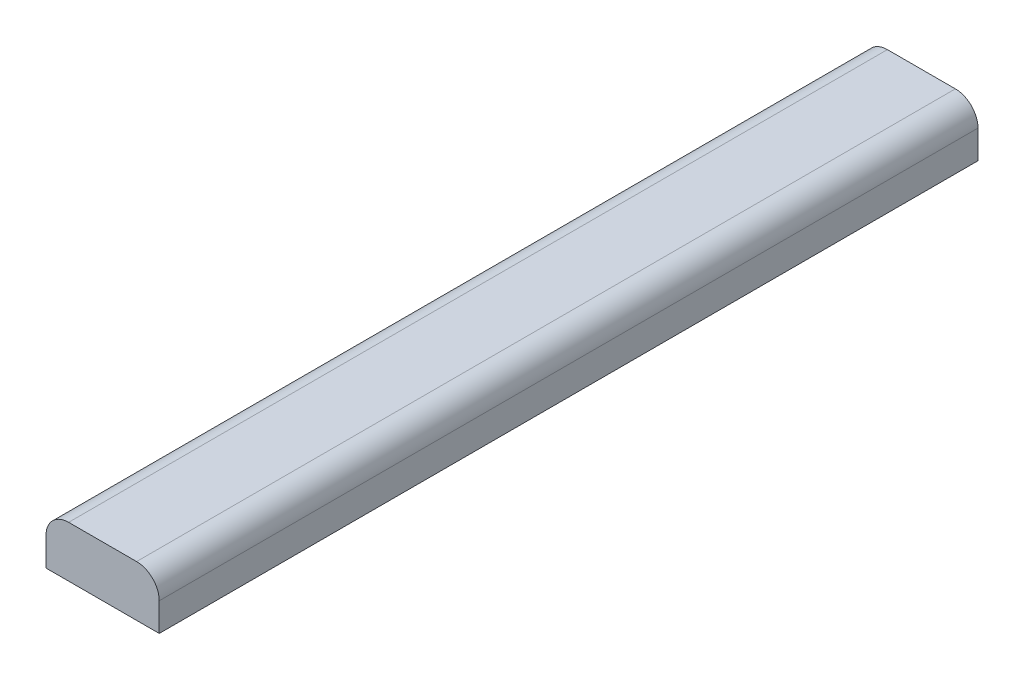
ISO-10303-21;
HEADER;
FILE_DESCRIPTION(('STEP AP214'),'2;1');
FILE_NAME('part.step','',(''),(''),'','','');
FILE_SCHEMA(('AUTOMOTIVE_DESIGN { 1 0 10303 214 1 1 1 1 }'));
ENDSEC;
DATA;
#1=APPLICATION_CONTEXT('core data for automotive mechanical design processes');
#2=APPLICATION_PROTOCOL_DEFINITION('international standard','automotive_design',2000,#1);
#3=PRODUCT_CONTEXT('',#1,'mechanical');
#4=PRODUCT('Part','Part','',(#3));
#5=PRODUCT_RELATED_PRODUCT_CATEGORY('part','',(#4));
#6=PRODUCT_DEFINITION_FORMATION('','',#4);
#7=PRODUCT_DEFINITION_CONTEXT('part definition',#1,'design');
#8=PRODUCT_DEFINITION('design','',#6,#7);
#9=PRODUCT_DEFINITION_SHAPE('','',#8);
#10=(LENGTH_UNIT() NAMED_UNIT(*) SI_UNIT(.MILLI.,.METRE.));
#11=(NAMED_UNIT(*) PLANE_ANGLE_UNIT() SI_UNIT($,.RADIAN.));
#12=(NAMED_UNIT(*) SI_UNIT($,.STERADIAN.) SOLID_ANGLE_UNIT());
#13=UNCERTAINTY_MEASURE_WITH_UNIT(LENGTH_MEASURE(1.E-05),#10,'distance_accuracy_value','');
#14=(GEOMETRIC_REPRESENTATION_CONTEXT(3) GLOBAL_UNCERTAINTY_ASSIGNED_CONTEXT((#13)) GLOBAL_UNIT_ASSIGNED_CONTEXT((#10,
#11,#12)) REPRESENTATION_CONTEXT('',''));
#15=CARTESIAN_POINT('',(0.,0.,0.));
#16=DIRECTION('',(0.,0.,1.));
#17=DIRECTION('',(1.,0.,0.));
#18=AXIS2_PLACEMENT_3D('',#15,#16,#17);
#19=CARTESIAN_POINT('',(0.,0.,918.21));
#20=DIRECTION('',(1.,0.,0.));
#21=DIRECTION('',(0.,0.,-1.));
#22=AXIS2_PLACEMENT_3D('',#19,#20,#21);
#23=PLANE('',#22);
#24=DIRECTION('',(0.,-1.,0.));
#25=VECTOR('',#24,1.);
#26=CARTESIAN_POINT('',(0.,0.,0.));
#27=LINE('',#26,#25);
#28=CARTESIAN_POINT('',(0.,31.7499999999998,0.));
#29=VERTEX_POINT('',#28);
#30=CARTESIAN_POINT('',(0.,0.,0.));
#31=VERTEX_POINT('',#30);
#32=EDGE_CURVE('E131',#29,#31,#27,.T.);
#33=ORIENTED_EDGE('',*,*,#32,.T.);
#34=DIRECTION('',(0.,0.,-1.));
#35=VECTOR('',#34,1.);
#36=CARTESIAN_POINT('',(0.,0.,918.21));
#37=LINE('',#36,#35);
#38=CARTESIAN_POINT('',(0.,0.,918.21));
#39=VERTEX_POINT('',#38);
#40=EDGE_CURVE('E11',#39,#31,#37,.T.);
#41=ORIENTED_EDGE('',*,*,#40,.F.);
#42=DIRECTION('',(0.,-1.,0.));
#43=VECTOR('',#42,1.);
#44=CARTESIAN_POINT('',(0.,0.,918.21));
#45=LINE('',#44,#43);
#46=CARTESIAN_POINT('',(0.,31.7499999999998,918.21));
#47=VERTEX_POINT('',#46);
#48=EDGE_CURVE('E141',#47,#39,#45,.T.);
#49=ORIENTED_EDGE('',*,*,#48,.F.);
#50=DIRECTION('',(0.,0.,-1.));
#51=VECTOR('',#50,1.);
#52=CARTESIAN_POINT('',(0.,31.7499999999998,918.21));
#53=LINE('',#52,#51);
#54=EDGE_CURVE('E127',#47,#29,#53,.T.);
#55=ORIENTED_EDGE('',*,*,#54,.T.);
#56=EDGE_LOOP('',(#33,#41,#49,#55));
#57=FACE_BOUND('',#56,.T.);
#58=ADVANCED_FACE('F47',(#57),#23,.F.);
#59=CARTESIAN_POINT('',(0.,0.,918.21));
#60=DIRECTION('',(0.,1.,0.));
#61=DIRECTION('',(0.,0.,1.));
#62=AXIS2_PLACEMENT_3D('',#59,#60,#61);
#63=PLANE('',#62);
#64=DIRECTION('',(1.,0.,0.));
#65=VECTOR('',#64,1.);
#66=CARTESIAN_POINT('',(0.,0.,0.));
#67=LINE('',#66,#65);
#68=CARTESIAN_POINT('',(127.,0.,0.));
#69=VERTEX_POINT('',#68);
#70=EDGE_CURVE('E134',#31,#69,#67,.T.);
#71=ORIENTED_EDGE('',*,*,#70,.T.);
#72=DIRECTION('',(0.,0.,-1.));
#73=VECTOR('',#72,1.);
#74=CARTESIAN_POINT('',(127.,0.,918.21));
#75=LINE('',#74,#73);
#76=CARTESIAN_POINT('',(127.,0.,918.21));
#77=VERTEX_POINT('',#76);
#78=EDGE_CURVE('E55',#77,#69,#75,.T.);
#79=ORIENTED_EDGE('',*,*,#78,.F.);
#80=DIRECTION('',(1.,0.,0.));
#81=VECTOR('',#80,1.);
#82=CARTESIAN_POINT('',(0.,0.,918.21));
#83=LINE('',#82,#81);
#84=EDGE_CURVE('E100',#39,#77,#83,.T.);
#85=ORIENTED_EDGE('',*,*,#84,.F.);
#86=ORIENTED_EDGE('',*,*,#40,.T.);
#87=EDGE_LOOP('',(#71,#79,#85,#86));
#88=FACE_BOUND('',#87,.T.);
#89=ADVANCED_FACE('F166',(#88),#63,.F.);
#90=CARTESIAN_POINT('',(127.,0.,918.21));
#91=DIRECTION('',(-1.,0.,0.));
#92=DIRECTION('',(0.,0.,1.));
#93=AXIS2_PLACEMENT_3D('',#90,#91,#92);
#94=PLANE('',#93);
#95=DIRECTION('',(0.,1.,0.));
#96=VECTOR('',#95,1.);
#97=CARTESIAN_POINT('',(127.,0.,0.));
#98=LINE('',#97,#96);
#99=CARTESIAN_POINT('',(127.,31.7499999999998,0.));
#100=VERTEX_POINT('',#99);
#101=EDGE_CURVE('E136',#69,#100,#98,.T.);
#102=ORIENTED_EDGE('',*,*,#101,.T.);
#103=DIRECTION('',(0.,0.,-1.));
#104=VECTOR('',#103,1.);
#105=CARTESIAN_POINT('',(127.,31.7499999999998,918.21));
#106=LINE('',#105,#104);
#107=CARTESIAN_POINT('',(127.,31.7499999999998,918.21));
#108=VERTEX_POINT('',#107);
#109=EDGE_CURVE('E122',#108,#100,#106,.T.);
#110=ORIENTED_EDGE('',*,*,#109,.F.);
#111=DIRECTION('',(0.,1.,0.));
#112=VECTOR('',#111,1.);
#113=CARTESIAN_POINT('',(127.,0.,918.21));
#114=LINE('',#113,#112);
#115=EDGE_CURVE('E113',#77,#108,#114,.T.);
#116=ORIENTED_EDGE('',*,*,#115,.F.);
#117=ORIENTED_EDGE('',*,*,#78,.T.);
#118=EDGE_LOOP('',(#102,#110,#116,#117));
#119=FACE_BOUND('',#118,.T.);
#120=ADVANCED_FACE('F147',(#119),#94,.F.);
#121=CARTESIAN_POINT('',(101.6,31.75,918.21));
#122=DIRECTION('',(0.,0.,-1.));
#123=DIRECTION('',(-1.,0.,0.));
#124=AXIS2_PLACEMENT_3D('',#121,#122,#123);
#125=CYLINDRICAL_SURFACE('',#124,25.4);
#126=CARTESIAN_POINT('',(101.6,31.75,0.));
#127=DIRECTION('',(0.,0.,1.));
#128=DIRECTION('',(-1.,0.,0.));
#129=AXIS2_PLACEMENT_3D('',#126,#127,#128);
#130=CIRCLE('',#129,25.4);
#131=CARTESIAN_POINT('',(101.6,57.15,0.));
#132=VERTEX_POINT('',#131);
#133=EDGE_CURVE('E121',#100,#132,#130,.T.);
#134=ORIENTED_EDGE('',*,*,#133,.T.);
#135=DIRECTION('',(0.,0.,-1.));
#136=VECTOR('',#135,1.);
#137=CARTESIAN_POINT('',(101.6,57.15,918.21));
#138=LINE('',#137,#136);
#139=CARTESIAN_POINT('',(101.6,57.15,918.21));
#140=VERTEX_POINT('',#139);
#141=EDGE_CURVE('E118',#140,#132,#138,.T.);
#142=ORIENTED_EDGE('',*,*,#141,.F.);
#143=CARTESIAN_POINT('',(101.6,31.75,918.21));
#144=DIRECTION('',(0.,0.,1.));
#145=DIRECTION('',(-1.,0.,0.));
#146=AXIS2_PLACEMENT_3D('',#143,#144,#145);
#147=CIRCLE('',#146,25.4);
#148=EDGE_CURVE('E107',#108,#140,#147,.T.);
#149=ORIENTED_EDGE('',*,*,#148,.F.);
#150=ORIENTED_EDGE('',*,*,#109,.T.);
#151=EDGE_LOOP('',(#134,#142,#149,#150));
#152=FACE_BOUND('',#151,.T.);
#153=ADVANCED_FACE('F119',(#152),#125,.T.);
#154=CARTESIAN_POINT('',(25.4000000000002,57.15,918.21));
#155=DIRECTION('',(0.,-1.,0.));
#156=DIRECTION('',(0.,0.,-1.));
#157=AXIS2_PLACEMENT_3D('',#154,#155,#156);
#158=PLANE('',#157);
#159=DIRECTION('',(-1.,0.,0.));
#160=VECTOR('',#159,1.);
#161=CARTESIAN_POINT('',(25.4000000000002,57.15,0.));
#162=LINE('',#161,#160);
#163=CARTESIAN_POINT('',(25.4000000000002,57.15,0.));
#164=VERTEX_POINT('',#163);
#165=EDGE_CURVE('E86',#132,#164,#162,.T.);
#166=ORIENTED_EDGE('',*,*,#165,.T.);
#167=DIRECTION('',(0.,0.,-1.));
#168=VECTOR('',#167,1.);
#169=CARTESIAN_POINT('',(25.4000000000002,57.15,918.21));
#170=LINE('',#169,#168);
#171=CARTESIAN_POINT('',(25.4000000000002,57.15,918.21));
#172=VERTEX_POINT('',#171);
#173=EDGE_CURVE('E123',#172,#164,#170,.T.);
#174=ORIENTED_EDGE('',*,*,#173,.F.);
#175=DIRECTION('',(-1.,0.,0.));
#176=VECTOR('',#175,1.);
#177=CARTESIAN_POINT('',(25.4000000000002,57.15,918.21));
#178=LINE('',#177,#176);
#179=EDGE_CURVE('E111',#140,#172,#178,.T.);
#180=ORIENTED_EDGE('',*,*,#179,.F.);
#181=ORIENTED_EDGE('',*,*,#141,.T.);
#182=EDGE_LOOP('',(#166,#174,#180,#181));
#183=FACE_BOUND('',#182,.T.);
#184=ADVANCED_FACE('F125',(#183),#158,.F.);
#185=CARTESIAN_POINT('',(25.4,31.75,918.21));
#186=DIRECTION('',(0.,0.,-1.));
#187=DIRECTION('',(-1.,0.,0.));
#188=AXIS2_PLACEMENT_3D('',#185,#186,#187);
#189=CYLINDRICAL_SURFACE('',#188,25.4);
#190=CARTESIAN_POINT('',(25.4,31.75,0.));
#191=DIRECTION('',(0.,0.,1.));
#192=DIRECTION('',(-1.,0.,0.));
#193=AXIS2_PLACEMENT_3D('',#190,#191,#192);
#194=CIRCLE('',#193,25.4);
#195=EDGE_CURVE('E92',#164,#29,#194,.T.);
#196=ORIENTED_EDGE('',*,*,#195,.T.);
#197=ORIENTED_EDGE('',*,*,#54,.F.);
#198=CARTESIAN_POINT('',(25.4,31.75,918.21));
#199=DIRECTION('',(0.,0.,1.));
#200=DIRECTION('',(-1.,0.,0.));
#201=AXIS2_PLACEMENT_3D('',#198,#199,#200);
#202=CIRCLE('',#201,25.4);
#203=EDGE_CURVE('E63',#172,#47,#202,.T.);
#204=ORIENTED_EDGE('',*,*,#203,.F.);
#205=ORIENTED_EDGE('',*,*,#173,.T.);
#206=EDGE_LOOP('',(#196,#197,#204,#205));
#207=FACE_BOUND('',#206,.T.);
#208=ADVANCED_FACE('F154',(#207),#189,.T.);
#209=CARTESIAN_POINT('',(25.4,31.75,918.21));
#210=DIRECTION('',(0.,0.,-1.));
#211=DIRECTION('',(-1.,0.,0.));
#212=AXIS2_PLACEMENT_3D('',#209,#210,#211);
#213=PLANE('',#212);
#214=ORIENTED_EDGE('',*,*,#48,.T.);
#215=ORIENTED_EDGE('',*,*,#84,.T.);
#216=ORIENTED_EDGE('',*,*,#115,.T.);
#217=ORIENTED_EDGE('',*,*,#148,.T.);
#218=ORIENTED_EDGE('',*,*,#179,.T.);
#219=ORIENTED_EDGE('',*,*,#203,.T.);
#220=EDGE_LOOP('',(#214,#215,#216,#217,#218,#219));
#221=FACE_BOUND('',#220,.T.);
#222=ADVANCED_FACE('F109',(#221),#213,.F.);
#223=CARTESIAN_POINT('',(25.4,31.75,0.));
#224=DIRECTION('',(0.,0.,-1.));
#225=DIRECTION('',(-1.,0.,0.));
#226=AXIS2_PLACEMENT_3D('',#223,#224,#225);
#227=PLANE('',#226);
#228=ORIENTED_EDGE('',*,*,#32,.F.);
#229=ORIENTED_EDGE('',*,*,#195,.F.);
#230=ORIENTED_EDGE('',*,*,#165,.F.);
#231=ORIENTED_EDGE('',*,*,#133,.F.);
#232=ORIENTED_EDGE('',*,*,#101,.F.);
#233=ORIENTED_EDGE('',*,*,#70,.F.);
#234=EDGE_LOOP('',(#228,#229,#230,#231,#232,#233));
#235=FACE_BOUND('',#234,.T.);
#236=ADVANCED_FACE('F150',(#235),#227,.T.);
#237=CLOSED_SHELL('',(#58,#89,#120,#153,#184,#208,#222,#236));
#238=MANIFOLD_SOLID_BREP('B2',#237);
#239=ADVANCED_BREP_SHAPE_REPRESENTATION('',(#18,#238),#14);
#240=SHAPE_DEFINITION_REPRESENTATION(#9,#239);
ENDSEC;
END-ISO-10303-21;
